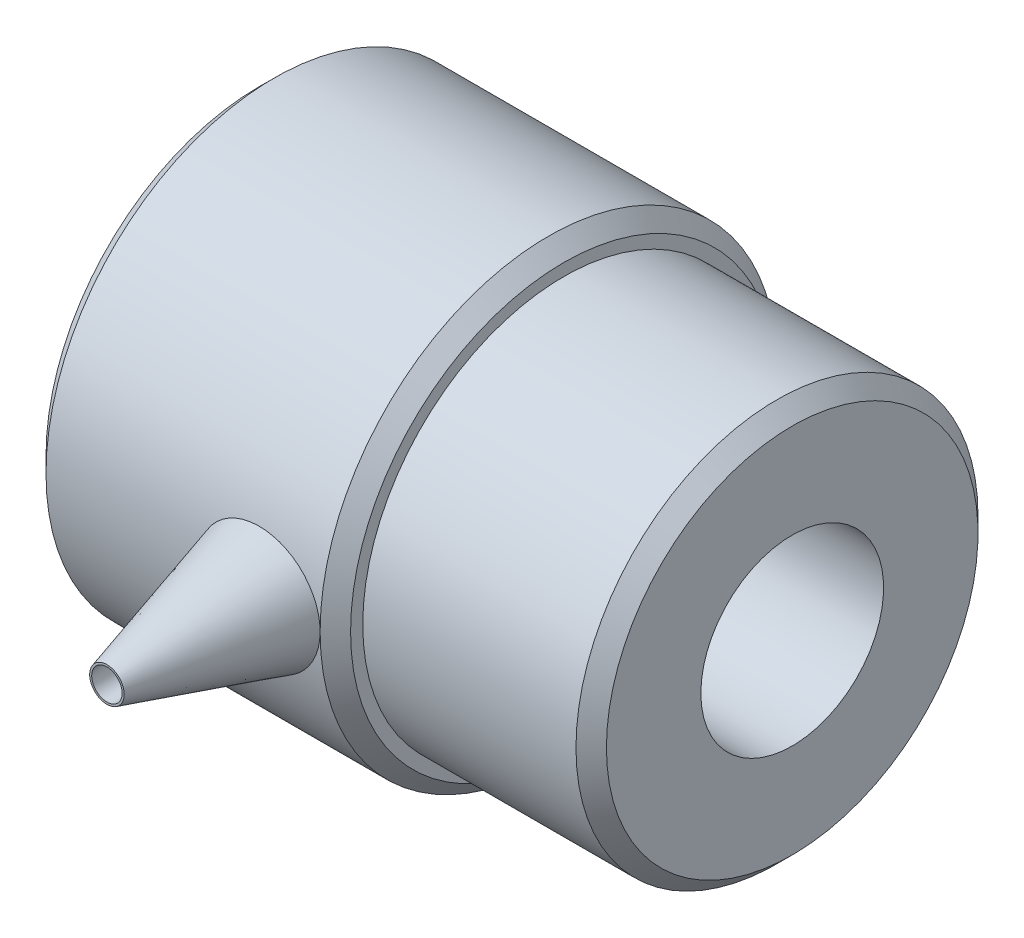
ISO-10303-21;
HEADER;
FILE_DESCRIPTION(('STEP AP214'),'2;1');
FILE_NAME('part.step','',(''),(''),'','','');
FILE_SCHEMA(('AUTOMOTIVE_DESIGN { 1 0 10303 214 1 1 1 1 }'));
ENDSEC;
DATA;
#1=APPLICATION_CONTEXT('core data for automotive mechanical design processes');
#2=APPLICATION_PROTOCOL_DEFINITION('international standard','automotive_design',2000,#1);
#3=PRODUCT_CONTEXT('',#1,'mechanical');
#4=PRODUCT('Part','Part','',(#3));
#5=PRODUCT_RELATED_PRODUCT_CATEGORY('part','',(#4));
#6=PRODUCT_DEFINITION_FORMATION('','',#4);
#7=PRODUCT_DEFINITION_CONTEXT('part definition',#1,'design');
#8=PRODUCT_DEFINITION('design','',#6,#7);
#9=PRODUCT_DEFINITION_SHAPE('','',#8);
#10=(LENGTH_UNIT() NAMED_UNIT(*) SI_UNIT(.MILLI.,.METRE.));
#11=(NAMED_UNIT(*) PLANE_ANGLE_UNIT() SI_UNIT($,.RADIAN.));
#12=(NAMED_UNIT(*) SI_UNIT($,.STERADIAN.) SOLID_ANGLE_UNIT());
#13=UNCERTAINTY_MEASURE_WITH_UNIT(LENGTH_MEASURE(1.E-05),#10,'distance_accuracy_value','');
#14=(GEOMETRIC_REPRESENTATION_CONTEXT(3) GLOBAL_UNCERTAINTY_ASSIGNED_CONTEXT((#13)) GLOBAL_UNIT_ASSIGNED_CONTEXT((#10,
#11,#12)) REPRESENTATION_CONTEXT('',''));
#15=CARTESIAN_POINT('',(0.,0.,0.));
#16=DIRECTION('',(0.,0.,1.));
#17=DIRECTION('',(1.,0.,0.));
#18=AXIS2_PLACEMENT_3D('',#15,#16,#17);
#19=CARTESIAN_POINT('',(-20.,0.,25.));
#20=DIRECTION('',(0.,0.,1.));
#21=DIRECTION('',(1.,0.,0.));
#22=AXIS2_PLACEMENT_3D('',#19,#20,#21);
#23=PLANE('',#22);
#24=CARTESIAN_POINT('',(-20.,0.,25.));
#25=DIRECTION('',(0.,0.,1.));
#26=DIRECTION('',(1.,0.,0.));
#27=AXIS2_PLACEMENT_3D('',#24,#25,#26);
#28=CIRCLE('',#27,1.13254614241192);
#29=CARTESIAN_POINT('',(-18.8674538575881,0.,25.));
#30=VERTEX_POINT('',#29);
#31=EDGE_CURVE('E13',#30,#30,#28,.T.);
#32=ORIENTED_EDGE('',*,*,#31,.T.);
#33=EDGE_LOOP('',(#32));
#34=FACE_BOUND('',#33,.T.);
#35=CARTESIAN_POINT('',(-20.,0.,25.));
#36=DIRECTION('',(0.,0.,1.));
#37=DIRECTION('',(1.,0.,0.));
#38=AXIS2_PLACEMENT_3D('',#35,#36,#37);
#39=CIRCLE('',#38,1.);
#40=CARTESIAN_POINT('',(-19.,0.,25.));
#41=VERTEX_POINT('',#40);
#42=EDGE_CURVE('E65',#41,#41,#39,.F.);
#43=ORIENTED_EDGE('',*,*,#42,.T.);
#44=EDGE_LOOP('',(#43));
#45=FACE_BOUND('',#44,.T.);
#46=ADVANCED_FACE('F54',(#34,#45),#23,.T.);
#47=CARTESIAN_POINT('',(-20.,0.,15.));
#48=DIRECTION('',(0.,0.,1.));
#49=DIRECTION('',(1.,0.,0.));
#50=AXIS2_PLACEMENT_3D('',#47,#48,#49);
#51=PLANE('',#50);
#52=CARTESIAN_POINT('',(-20.,0.,15.));
#53=DIRECTION('',(0.,0.,1.));
#54=DIRECTION('',(1.,0.,0.));
#55=AXIS2_PLACEMENT_3D('',#52,#53,#54);
#56=CIRCLE('',#55,4.);
#57=CARTESIAN_POINT('',(-16.,0.,15.));
#58=VERTEX_POINT('',#57);
#59=EDGE_CURVE('E61',#58,#58,#56,.T.);
#60=ORIENTED_EDGE('',*,*,#59,.F.);
#61=EDGE_LOOP('',(#60));
#62=FACE_BOUND('',#61,.T.);
#63=CARTESIAN_POINT('',(-20.,0.,15.));
#64=DIRECTION('',(0.,0.,1.));
#65=DIRECTION('',(1.,0.,0.));
#66=AXIS2_PLACEMENT_3D('',#63,#64,#65);
#67=CIRCLE('',#66,1.);
#68=CARTESIAN_POINT('',(-19.,0.,15.));
#69=VERTEX_POINT('',#68);
#70=EDGE_CURVE('E69',#69,#69,#67,.T.);
#71=ORIENTED_EDGE('',*,*,#70,.T.);
#72=EDGE_LOOP('',(#71));
#73=FACE_BOUND('',#72,.T.);
#74=ADVANCED_FACE('F75',(#62,#73),#51,.F.);
#75=CARTESIAN_POINT('',(-20.,0.,15.));
#76=DIRECTION('',(0.,0.,-1.));
#77=DIRECTION('',(1.,0.,0.));
#78=AXIS2_PLACEMENT_3D('',#75,#76,#77);
#79=CONICAL_SURFACE('',#78,4.,0.279252680319093);
#80=CARTESIAN_POINT('',(-18.8674538575881,0.,25.));
#81=CARTESIAN_POINT('',(-18.8375845465715,0.,24.8958333333333));
#82=CARTESIAN_POINT('',(-18.807715235555,0.,24.7916666666667));
#83=CARTESIAN_POINT('',(-18.7479766135219,0.,24.5833333333333));
#84=CARTESIAN_POINT('',(-18.7181073025054,0.,24.4791666666667));
#85=CARTESIAN_POINT('',(-18.6583686804723,0.,24.2708333333333));
#86=CARTESIAN_POINT('',(-18.6284993694557,0.,24.1666666666667));
#87=CARTESIAN_POINT('',(-18.5687607474227,0.,23.9583333333333));
#88=CARTESIAN_POINT('',(-18.5388914364061,0.,23.8541666666667));
#89=CARTESIAN_POINT('',(-18.479152814373,0.,23.6458333333333));
#90=CARTESIAN_POINT('',(-18.4492835033565,0.,23.5416666666667));
#91=CARTESIAN_POINT('',(-18.3895448813234,0.,23.3333333333333));
#92=CARTESIAN_POINT('',(-18.3596755703069,0.,23.2291666666667));
#93=CARTESIAN_POINT('',(-18.2999369482738,0.,23.0208333333333));
#94=CARTESIAN_POINT('',(-18.2700676372572,0.,22.9166666666667));
#95=CARTESIAN_POINT('',(-18.2103290152242,0.,22.7083333333333));
#96=CARTESIAN_POINT('',(-18.1804597042076,0.,22.6041666666667));
#97=CARTESIAN_POINT('',(-18.1207210821745,0.,22.3958333333333));
#98=CARTESIAN_POINT('',(-18.090851771158,0.,22.2916666666667));
#99=CARTESIAN_POINT('',(-18.0311131491249,0.,22.0833333333333));
#100=CARTESIAN_POINT('',(-18.0012438381084,0.,21.9791666666667));
#101=CARTESIAN_POINT('',(-17.9415052160753,0.,21.7708333333333));
#102=CARTESIAN_POINT('',(-17.9116359050587,0.,21.6666666666667));
#103=CARTESIAN_POINT('',(-17.8518972830256,0.,21.4583333333333));
#104=CARTESIAN_POINT('',(-17.8220279720091,0.,21.3541666666667));
#105=CARTESIAN_POINT('',(-17.762289349976,0.,21.1458333333333));
#106=CARTESIAN_POINT('',(-17.7324200389595,0.,21.0416666666667));
#107=CARTESIAN_POINT('',(-17.6726814169264,0.,20.8333333333333));
#108=CARTESIAN_POINT('',(-17.6428121059098,0.,20.7291666666667));
#109=CARTESIAN_POINT('',(-17.5830734838768,0.,20.5208333333333));
#110=CARTESIAN_POINT('',(-17.5532041728602,0.,20.4166666666667));
#111=CARTESIAN_POINT('',(-17.4934655508271,0.,20.2083333333333));
#112=CARTESIAN_POINT('',(-17.4635962398106,0.,20.1041666666667));
#113=CARTESIAN_POINT('',(-17.4038576177775,0.,19.8958333333333));
#114=CARTESIAN_POINT('',(-17.373988306761,0.,19.7916666666667));
#115=CARTESIAN_POINT('',(-17.3142496847279,0.,19.5833333333333));
#116=CARTESIAN_POINT('',(-17.2843803737113,0.,19.4791666666667));
#117=CARTESIAN_POINT('',(-17.2246417516782,0.,19.2708333333333));
#118=CARTESIAN_POINT('',(-17.1947724406617,0.,19.1666666666667));
#119=CARTESIAN_POINT('',(-17.1350338186286,0.,18.9583333333333));
#120=CARTESIAN_POINT('',(-17.1051645076121,0.,18.8541666666667));
#121=CARTESIAN_POINT('',(-17.045425885579,0.,18.6458333333333));
#122=CARTESIAN_POINT('',(-17.0155565745624,0.,18.5416666666667));
#123=CARTESIAN_POINT('',(-16.9558179525294,0.,18.3333333333333));
#124=CARTESIAN_POINT('',(-16.9259486415128,0.,18.2291666666667));
#125=CARTESIAN_POINT('',(-16.8662100194797,0.,18.0208333333333));
#126=CARTESIAN_POINT('',(-16.8363407084632,0.,17.9166666666667));
#127=CARTESIAN_POINT('',(-16.7766020864301,0.,17.7083333333333));
#128=CARTESIAN_POINT('',(-16.7467327754136,0.,17.6041666666667));
#129=CARTESIAN_POINT('',(-16.6869941533805,0.,17.3958333333333));
#130=CARTESIAN_POINT('',(-16.6571248423639,0.,17.2916666666667));
#131=CARTESIAN_POINT('',(-16.5973862203309,0.,17.0833333333333));
#132=CARTESIAN_POINT('',(-16.5675169093143,0.,16.9791666666667));
#133=CARTESIAN_POINT('',(-16.5077782872812,0.,16.7708333333333));
#134=CARTESIAN_POINT('',(-16.4779089762647,0.,16.6666666666667));
#135=CARTESIAN_POINT('',(-16.4181703542316,0.,16.4583333333333));
#136=CARTESIAN_POINT('',(-16.3883010432151,0.,16.3541666666667));
#137=CARTESIAN_POINT('',(-16.328562421182,0.,16.1458333333333));
#138=CARTESIAN_POINT('',(-16.2986931101654,0.,16.0416666666667));
#139=CARTESIAN_POINT('',(-16.2389544881323,0.,15.8333333333333));
#140=CARTESIAN_POINT('',(-16.2090851771158,0.,15.7291666666667));
#141=CARTESIAN_POINT('',(-16.1493465550827,0.,15.5208333333333));
#142=CARTESIAN_POINT('',(-16.1194772440662,0.,15.4166666666667));
#143=CARTESIAN_POINT('',(-16.0597386220331,0.,15.2083333333333));
#144=CARTESIAN_POINT('',(-16.0298693110165,0.,15.1041666666667));
#145=CARTESIAN_POINT('',(-16.,0.,15.));
#146=B_SPLINE_CURVE_WITH_KNOTS('',3,(#80,#81,#82,#83,#84,#85,#86,#87,#88,#89,#90,#91,#92,#93,
#94,#95,#96,#97,#98,#99,#100,#101,#102,#103,#104,#105,#106,#107,#108,#109,#110,#111,#112,#113,
#114,#115,#116,#117,#118,#119,#120,#121,#122,#123,#124,#125,#126,#127,#128,#129,#130,#131,#132,
#133,#134,#135,#136,#137,#138,#139,#140,#141,#142,#143,#144,#145),.UNSPECIFIED.,.F.,.F.,(4,2,2,
2,2,2,2,2,2,2,2,2,2,2,2,2,2,2,2,2,2,2,2,2,2,2,2,2,2,2,2,2,4),(0.,0.32509357370675,
0.650187147413502,0.975280721120249,1.300374294827,1.62546786853375,1.9505614422405,
2.27565501594725,2.600748589654,2.92584216336075,3.2509357370675,3.57602931077426,
3.90112288448101,4.22621645818776,4.55131003189451,4.87640360560126,5.20149717930801,
5.52659075301476,5.85168432672151,6.17677790042826,6.50187147413501,6.82696504784176,
7.15205862154852,7.47715219525527,7.80224576896202,8.12733934266877,8.45243291637552,
8.77752649008227,9.10262006378902,9.42771363749577,9.75280721120252,10.0779007849093,
10.402994358616),.UNSPECIFIED.);
#147=EDGE_CURVE('BSEAM56',#30,#58,#146,.T.);
#148=ORIENTED_EDGE('',*,*,#31,.F.);
#149=ORIENTED_EDGE('',*,*,#59,.T.);
#150=ORIENTED_EDGE('',*,*,#147,.T.);
#151=ORIENTED_EDGE('',*,*,#147,.F.);
#152=EDGE_LOOP('',(#148,#150,#149,#151));
#153=FACE_BOUND('',#152,.T.);
#154=ADVANCED_FACE('F56',(#153),#79,.T.);
#155=CARTESIAN_POINT('',(-20.,0.,35.));
#156=DIRECTION('',(0.,0.,-1.));
#157=DIRECTION('',(-1.,0.,0.));
#158=AXIS2_PLACEMENT_3D('',#155,#156,#157);
#159=CYLINDRICAL_SURFACE('',#158,1.);
#160=ORIENTED_EDGE('',*,*,#42,.F.);
#161=EDGE_LOOP('',(#160));
#162=FACE_BOUND('',#161,.T.);
#163=ORIENTED_EDGE('',*,*,#70,.F.);
#164=EDGE_LOOP('',(#163));
#165=FACE_BOUND('',#164,.T.);
#166=ADVANCED_FACE('F77',(#162,#165),#159,.F.);
#167=CLOSED_SHELL('',(#46,#74,#154,#166));
#168=MANIFOLD_SOLID_BREP('B2',#167);
#169=CARTESIAN_POINT('',(-35.,0.,0.));
#170=DIRECTION('',(-1.,0.,0.));
#171=DIRECTION('',(0.,0.,1.));
#172=AXIS2_PLACEMENT_3D('',#169,#170,#171);
#173=CYLINDRICAL_SURFACE('',#172,13.2);
#174=CARTESIAN_POINT('',(-1.,0.,0.));
#175=DIRECTION('',(-1.,0.,0.));
#176=DIRECTION('',(0.,0.,1.));
#177=AXIS2_PLACEMENT_3D('',#174,#175,#176);
#178=CIRCLE('',#177,13.2);
#179=CARTESIAN_POINT('',(-1.,0.,13.2));
#180=VERTEX_POINT('',#179);
#181=EDGE_CURVE('E136',#180,#180,#178,.T.);
#182=ORIENTED_EDGE('',*,*,#181,.T.);
#183=EDGE_LOOP('',(#182));
#184=FACE_BOUND('',#183,.T.);
#185=CARTESIAN_POINT('',(-15.,0.,0.));
#186=DIRECTION('',(-1.,0.,0.));
#187=DIRECTION('',(0.,0.,1.));
#188=AXIS2_PLACEMENT_3D('',#185,#186,#187);
#189=CIRCLE('',#188,13.2);
#190=CARTESIAN_POINT('',(-15.,0.,13.2));
#191=VERTEX_POINT('',#190);
#192=EDGE_CURVE('E184',#191,#191,#189,.T.);
#193=ORIENTED_EDGE('',*,*,#192,.F.);
#194=EDGE_LOOP('',(#193));
#195=FACE_BOUND('',#194,.T.);
#196=ADVANCED_FACE('F121',(#184,#195),#173,.T.);
#197=CARTESIAN_POINT('',(0.,6.,0.));
#198=DIRECTION('',(-1.,0.,0.));
#199=DIRECTION('',(0.,0.,1.));
#200=AXIS2_PLACEMENT_3D('',#197,#198,#199);
#201=PLANE('',#200);
#202=CARTESIAN_POINT('',(0.,0.,0.));
#203=DIRECTION('',(-1.,0.,0.));
#204=DIRECTION('',(0.,0.,1.));
#205=AXIS2_PLACEMENT_3D('',#202,#203,#204);
#206=CIRCLE('',#205,12.2);
#207=CARTESIAN_POINT('',(0.,0.,12.2));
#208=VERTEX_POINT('',#207);
#209=EDGE_CURVE('E132',#208,#208,#206,.F.);
#210=ORIENTED_EDGE('',*,*,#209,.T.);
#211=EDGE_LOOP('',(#210));
#212=FACE_BOUND('',#211,.T.);
#213=CARTESIAN_POINT('',(0.,0.,0.));
#214=DIRECTION('',(-1.,0.,0.));
#215=DIRECTION('',(0.,0.,1.));
#216=AXIS2_PLACEMENT_3D('',#213,#214,#215);
#217=CIRCLE('',#216,6.);
#218=CARTESIAN_POINT('',(0.,0.,6.));
#219=VERTEX_POINT('',#218);
#220=EDGE_CURVE('E166',#219,#219,#217,.T.);
#221=ORIENTED_EDGE('',*,*,#220,.T.);
#222=EDGE_LOOP('',(#221));
#223=FACE_BOUND('',#222,.T.);
#224=ADVANCED_FACE('F227',(#212,#223),#201,.F.);
#225=CARTESIAN_POINT('',(-35.,0.,0.));
#226=DIRECTION('',(-1.,0.,0.));
#227=DIRECTION('',(0.,0.,1.));
#228=AXIS2_PLACEMENT_3D('',#225,#226,#227);
#229=CYLINDRICAL_SURFACE('',#228,6.);
#230=CARTESIAN_POINT('',(-14.6196755796559,0.,0.));
#231=DIRECTION('',(1.,0.,0.));
#232=DIRECTION('',(0.,0.,-1.));
#233=AXIS2_PLACEMENT_3D('',#230,#231,#232);
#234=CIRCLE('',#233,6.);
#235=CARTESIAN_POINT('',(-14.6196755796559,0.,-6.));
#236=VERTEX_POINT('',#235);
#237=EDGE_CURVE('E157',#236,#236,#234,.F.);
#238=ORIENTED_EDGE('',*,*,#237,.T.);
#239=EDGE_LOOP('',(#238));
#240=FACE_BOUND('',#239,.T.);
#241=ORIENTED_EDGE('',*,*,#220,.F.);
#242=EDGE_LOOP('',(#241));
#243=FACE_BOUND('',#242,.T.);
#244=ADVANCED_FACE('F233',(#240,#243),#229,.F.);
#245=CARTESIAN_POINT('',(-15.1196755796559,11.,0.));
#246=DIRECTION('',(1.,0.,0.));
#247=DIRECTION('',(0.,0.,-1.));
#248=AXIS2_PLACEMENT_3D('',#245,#246,#247);
#249=PLANE('',#248);
#250=CARTESIAN_POINT('',(-15.1196755796559,0.,0.));
#251=DIRECTION('',(1.,0.,0.));
#252=DIRECTION('',(0.,0.,-1.));
#253=AXIS2_PLACEMENT_3D('',#250,#251,#252);
#254=CIRCLE('',#253,6.50000000000001);
#255=CARTESIAN_POINT('',(-15.1196755796559,0.,-6.50000000000001));
#256=VERTEX_POINT('',#255);
#257=EDGE_CURVE('E154',#256,#256,#254,.T.);
#258=ORIENTED_EDGE('',*,*,#257,.T.);
#259=EDGE_LOOP('',(#258));
#260=FACE_BOUND('',#259,.T.);
#261=CARTESIAN_POINT('',(-15.1196755796559,0.,0.));
#262=DIRECTION('',(-1.,0.,0.));
#263=DIRECTION('',(0.,0.,1.));
#264=AXIS2_PLACEMENT_3D('',#261,#262,#263);
#265=CIRCLE('',#264,11.);
#266=CARTESIAN_POINT('',(-15.1196755796559,0.,11.));
#267=VERTEX_POINT('',#266);
#268=EDGE_CURVE('E169',#267,#267,#265,.T.);
#269=ORIENTED_EDGE('',*,*,#268,.T.);
#270=EDGE_LOOP('',(#269));
#271=FACE_BOUND('',#270,.T.);
#272=ADVANCED_FACE('F335',(#260,#271),#249,.F.);
#273=CARTESIAN_POINT('',(-35.,0.,0.));
#274=DIRECTION('',(-1.,0.,0.));
#275=DIRECTION('',(0.,0.,1.));
#276=AXIS2_PLACEMENT_3D('',#273,#274,#275);
#277=CYLINDRICAL_SURFACE('',#276,11.);
#278=ORIENTED_EDGE('',*,*,#268,.F.);
#279=EDGE_LOOP('',(#278));
#280=FACE_BOUND('',#279,.T.);
#281=CARTESIAN_POINT('',(-17.1196755796559,0.,0.));
#282=DIRECTION('',(-1.,0.,0.));
#283=DIRECTION('',(0.,0.,1.));
#284=AXIS2_PLACEMENT_3D('',#281,#282,#283);
#285=CIRCLE('',#284,11.);
#286=CARTESIAN_POINT('',(-17.1196755796559,0.,11.));
#287=VERTEX_POINT('',#286);
#288=EDGE_CURVE('E172',#287,#287,#285,.T.);
#289=ORIENTED_EDGE('',*,*,#288,.T.);
#290=EDGE_LOOP('',(#289));
#291=FACE_BOUND('',#290,.T.);
#292=ADVANCED_FACE('F327',(#280,#291),#277,.F.);
#293=CARTESIAN_POINT('',(-17.1196755796559,10.,0.));
#294=DIRECTION('',(-1.,0.,0.));
#295=DIRECTION('',(0.,0.,1.));
#296=AXIS2_PLACEMENT_3D('',#293,#294,#295);
#297=PLANE('',#296);
#298=ORIENTED_EDGE('',*,*,#288,.F.);
#299=EDGE_LOOP('',(#298));
#300=FACE_BOUND('',#299,.T.);
#301=CARTESIAN_POINT('',(-17.1196755796559,0.,0.));
#302=DIRECTION('',(-1.,0.,0.));
#303=DIRECTION('',(0.,0.,1.));
#304=AXIS2_PLACEMENT_3D('',#301,#302,#303);
#305=CIRCLE('',#304,10.);
#306=CARTESIAN_POINT('',(-17.1196755796559,0.,10.));
#307=VERTEX_POINT('',#306);
#308=EDGE_CURVE('E175',#307,#307,#305,.T.);
#309=ORIENTED_EDGE('',*,*,#308,.T.);
#310=EDGE_LOOP('',(#309));
#311=FACE_BOUND('',#310,.T.);
#312=ADVANCED_FACE('F223',(#300,#311),#297,.F.);
#313=CARTESIAN_POINT('',(-35.,0.,0.));
#314=DIRECTION('',(-1.,0.,0.));
#315=DIRECTION('',(0.,0.,1.));
#316=AXIS2_PLACEMENT_3D('',#313,#314,#315);
#317=CYLINDRICAL_SURFACE('',#316,10.);
#318=CARTESIAN_POINT('',(-17.5,0.,10.));
#319=CARTESIAN_POINT('',(-17.5000038762303,0.138126814449552,9.99999766446687));
#320=CARTESIAN_POINT('',(-17.5114859179563,0.276296929717938,9.99710963553044));
#321=CARTESIAN_POINT('',(-17.557041918845,0.548677206284221,9.98586856383157));
#322=CARTESIAN_POINT('',(-17.5911286825631,0.682885078117899,9.97751242366627));
#323=CARTESIAN_POINT('',(-17.6807320891035,0.943368120304295,9.9562604388672));
#324=CARTESIAN_POINT('',(-17.7362229978588,1.06965260571667,9.94337004736764));
#325=CARTESIAN_POINT('',(-17.8669689834081,1.31112021984071,9.91442239679369));
#326=CARTESIAN_POINT('',(-17.942224726865,1.4263029739146,9.89836503090261));
#327=CARTESIAN_POINT('',(-18.1120013160903,1.64466987883486,9.86445689319489));
#328=CARTESIAN_POINT('',(-18.2068526249318,1.74759281676843,9.84657845246877));
#329=CARTESIAN_POINT('',(-18.4124203415151,1.93624821200553,9.8112270019656));
#330=CARTESIAN_POINT('',(-18.5231385382449,2.02197872824865,9.79375403816446));
#331=CARTESIAN_POINT('',(-18.759325377895,2.17504423799829,9.76091292830281));
#332=CARTESIAN_POINT('',(-18.8849887180146,2.2420870265419,9.74557990774685));
#333=CARTESIAN_POINT('',(-19.1462473527667,2.35399484758457,9.71915824696694));
#334=CARTESIAN_POINT('',(-19.2818410555534,2.39886342573357,9.70806892824031));
#335=CARTESIAN_POINT('',(-19.5562391636694,2.46425806134127,9.69167461160538));
#336=CARTESIAN_POINT('',(-19.69492482673,2.48525378055342,9.68625818328352));
#337=CARTESIAN_POINT('',(-19.9739476149989,2.50376962511068,9.68148937432652));
#338=CARTESIAN_POINT('',(-20.1142844678202,2.50129356969685,9.68213600713215));
#339=CARTESIAN_POINT('',(-20.3890263462423,2.47331087439951,9.68932009194695));
#340=CARTESIAN_POINT('',(-20.5234927024422,2.44836390031772,9.69571438345489));
#341=CARTESIAN_POINT('',(-20.7862684181851,2.37704031150499,9.71344516118448));
#342=CARTESIAN_POINT('',(-20.9145773383815,2.33066217011565,9.72478199948731));
#343=CARTESIAN_POINT('',(-21.1628966937536,2.21731579656197,9.75125189842765));
#344=CARTESIAN_POINT('',(-21.282810286316,2.1501444453882,9.76642212449693));
#345=CARTESIAN_POINT('',(-21.5098645162614,1.99726046002491,9.79882851409985));
#346=CARTESIAN_POINT('',(-21.6170029134454,1.91154458134806,9.81606503891047));
#347=CARTESIAN_POINT('',(-21.818672692824,1.72110570780203,9.85126467566486));
#348=CARTESIAN_POINT('',(-21.9127574834356,1.61591043027643,9.86923449130002));
#349=CARTESIAN_POINT('',(-22.0820354041065,1.39101986250616,9.90343275964594));
#350=CARTESIAN_POINT('',(-22.1572279571059,1.27132412951324,9.91966115915679));
#351=CARTESIAN_POINT('',(-22.2867509770406,1.02019314780232,9.9486288682365));
#352=CARTESIAN_POINT('',(-22.3410089004241,0.888718988681039,9.96135600212878));
#353=CARTESIAN_POINT('',(-22.4265288428493,0.618126680238138,9.98179861652361));
#354=CARTESIAN_POINT('',(-22.4577952606969,0.479009998584141,9.98951505565468));
#355=CARTESIAN_POINT('',(-22.4957626092647,0.200899950650044,9.99892498785624));
#356=CARTESIAN_POINT('',(-22.5030717101255,0.0619945333136831,10.0007675584713));
#357=CARTESIAN_POINT('',(-22.4945849965742,-0.215054791335847,9.99864674690754));
#358=CARTESIAN_POINT('',(-22.4787912620014,-0.353198766074327,9.99468388736421));
#359=CARTESIAN_POINT('',(-22.4250484860144,-0.622690447960817,9.98149301878918));
#360=CARTESIAN_POINT('',(-22.3874312275384,-0.754108531614583,9.97234390309647));
#361=CARTESIAN_POINT('',(-22.2914881932859,-1.00876215408753,9.94981177723595));
#362=CARTESIAN_POINT('',(-22.2331603261446,-1.13199686505442,9.93642833949965));
#363=CARTESIAN_POINT('',(-22.0962731185422,-1.36920522404972,9.9065551321037));
#364=CARTESIAN_POINT('',(-22.0173731460057,-1.48297573639294,9.89001445610999));
#365=CARTESIAN_POINT('',(-21.8420168186714,-1.69587768940552,9.85574181979586));
#366=CARTESIAN_POINT('',(-21.7455574339706,-1.79500659828875,9.83800965421578));
#367=CARTESIAN_POINT('',(-21.5349967319272,-1.97831761345414,9.80281594932498));
#368=CARTESIAN_POINT('',(-21.4205204950007,-2.06207311270184,9.78537173637463));
#369=CARTESIAN_POINT('',(-21.1787789425524,-2.20918459835604,9.75321463970069));
#370=CARTESIAN_POINT('',(-21.0515141950493,-2.27254149026901,9.73850163474941));
#371=CARTESIAN_POINT('',(-20.7884904626563,-2.37658570101223,9.71363491194665));
#372=CARTESIAN_POINT('',(-20.6527872861462,-2.41740732773931,9.70345425375809));
#373=CARTESIAN_POINT('',(-20.3761506035745,-2.47557609990489,9.68877906706586));
#374=CARTESIAN_POINT('',(-20.2352182482976,-2.49292837912652,9.68428329504044));
#375=CARTESIAN_POINT('',(-19.9564649602307,-2.50339765056083,9.68158168701612));
#376=CARTESIAN_POINT('',(-19.8186709414559,-2.49719649630131,9.68319887888034));
#377=CARTESIAN_POINT('',(-19.5461601855562,-2.46229546385366,9.69213181672143));
#378=CARTESIAN_POINT('',(-19.4114433866447,-2.43359603781098,9.69944744817731));
#379=CARTESIAN_POINT('',(-19.1496525682236,-2.35488553240495,9.71885434473222));
#380=CARTESIAN_POINT('',(-19.0225378245995,-2.30500234113404,9.73091692061057));
#381=CARTESIAN_POINT('',(-18.7783910288107,-2.18544152267504,9.7584625954084));
#382=CARTESIAN_POINT('',(-18.6613603780219,-2.11576115005696,9.77394616867808));
#383=CARTESIAN_POINT('',(-18.4374089516633,-1.95644624772858,9.80709390439337));
#384=CARTESIAN_POINT('',(-18.3308315442934,-1.86633860485376,9.82480441386302));
#385=CARTESIAN_POINT('',(-18.1340882586743,-1.66964895198288,9.86013378743769));
#386=CARTESIAN_POINT('',(-18.0439262831451,-1.56306303543524,9.87775262878422));
#387=CARTESIAN_POINT('',(-17.8809811523923,-1.33411264450432,9.9112942607945));
#388=CARTESIAN_POINT('',(-17.8085423105474,-1.21149737052731,9.92718055609783));
#389=CARTESIAN_POINT('',(-17.6854208950991,-0.955443432517458,9.95508208291861));
#390=CARTESIAN_POINT('',(-17.6347227322524,-0.822012605727898,9.96710008666301));
#391=CARTESIAN_POINT('',(-17.5640469494506,-0.574017088739119,9.98413432609236));
#392=CARTESIAN_POINT('',(-17.5400812615776,-0.460633618180114,9.99004308421151));
#393=CARTESIAN_POINT('',(-17.5080567606301,-0.231510119227139,9.9979767538658));
#394=CARTESIAN_POINT('',(-17.4999967511578,-0.115770268737694,10.0000019575149));
#395=CARTESIAN_POINT('',(-17.5,0.,10.));
#396=B_SPLINE_CURVE_WITH_KNOTS('',3,(#318,#319,#320,#321,#322,#323,#324,#325,#326,#327,#328,
#329,#330,#331,#332,#333,#334,#335,#336,#337,#338,#339,#340,#341,#342,#343,#344,#345,#346,#347,
#348,#349,#350,#351,#352,#353,#354,#355,#356,#357,#358,#359,#360,#361,#362,#363,#364,#365,#366,
#367,#368,#369,#370,#371,#372,#373,#374,#375,#376,#377,#378,#379,#380,#381,#382,#383,#384,#385,
#386,#387,#388,#389,#390,#391,#392,#393,#394,#395),.UNSPECIFIED.,.T.,.F.,(4,2,2,2,2,2,2,2,2,2,2,
2,2,2,2,2,2,2,2,2,2,2,2,2,2,2,2,2,2,2,2,2,2,2,2,2,2,2,4),(0.,0.413956187453149,
0.828147062939832,1.24184150381018,1.65554990028221,2.07690725728565,2.4983121596677,
2.92597745909678,3.35357435282281,3.77260491835117,4.19156730193363,4.60037495017231,
5.00921172448931,5.42217546462,5.83521151399139,6.26002501620566,6.68485149269279,
7.11113715020724,7.53734122819939,7.95263848254328,8.36789835193438,8.77700457528929,
9.18615212209351,9.6025597928112,10.0190393835223,10.4457418201299,10.8724253125471,
11.2965375769764,11.7205570543048,12.1323963400748,12.5442273493652,12.9536066760887,
13.3630428023796,13.7831596069298,14.2033761629383,14.6312030917578,15.0587227304538,
15.4057040491338,15.7526592674819),.UNSPECIFIED.);
#397=CARTESIAN_POINT('',(-17.5,0.,10.));
#398=VERTEX_POINT('',#397);
#399=EDGE_CURVE('E187',#398,#398,#396,.T.);
#400=ORIENTED_EDGE('',*,*,#399,.T.);
#401=EDGE_LOOP('',(#400));
#402=FACE_BOUND('',#401,.T.);
#403=CARTESIAN_POINT('',(-32.5,0.,0.));
#404=DIRECTION('',(1.,0.,0.));
#405=DIRECTION('',(0.,0.,-1.));
#406=AXIS2_PLACEMENT_3D('',#403,#404,#405);
#407=CIRCLE('',#406,10.);
#408=CARTESIAN_POINT('',(-32.5,0.,-10.));
#409=VERTEX_POINT('',#408);
#410=EDGE_CURVE('E163',#409,#409,#407,.F.);
#411=ORIENTED_EDGE('',*,*,#410,.T.);
#412=EDGE_LOOP('',(#411));
#413=FACE_BOUND('',#412,.T.);
#414=ORIENTED_EDGE('',*,*,#308,.F.);
#415=EDGE_LOOP('',(#414));
#416=FACE_BOUND('',#415,.T.);
#417=ADVANCED_FACE('F192',(#402,#413,#416),#317,.F.);
#418=CARTESIAN_POINT('',(-33.,11.,0.));
#419=DIRECTION('',(1.,0.,0.));
#420=DIRECTION('',(0.,0.,-1.));
#421=AXIS2_PLACEMENT_3D('',#418,#419,#420);
#422=PLANE('',#421);
#423=CARTESIAN_POINT('',(-33.,0.,0.));
#424=DIRECTION('',(1.,0.,0.));
#425=DIRECTION('',(0.,0.,-1.));
#426=AXIS2_PLACEMENT_3D('',#423,#424,#425);
#427=CIRCLE('',#426,10.5);
#428=CARTESIAN_POINT('',(-33.,0.,-10.5));
#429=VERTEX_POINT('',#428);
#430=EDGE_CURVE('E160',#429,#429,#427,.T.);
#431=ORIENTED_EDGE('',*,*,#430,.T.);
#432=EDGE_LOOP('',(#431));
#433=FACE_BOUND('',#432,.T.);
#434=CARTESIAN_POINT('',(-33.,0.,0.));
#435=DIRECTION('',(-1.,0.,0.));
#436=DIRECTION('',(0.,0.,1.));
#437=AXIS2_PLACEMENT_3D('',#434,#435,#436);
#438=CIRCLE('',#437,11.);
#439=CARTESIAN_POINT('',(-33.,0.,11.));
#440=VERTEX_POINT('',#439);
#441=EDGE_CURVE('E178',#440,#440,#438,.T.);
#442=ORIENTED_EDGE('',*,*,#441,.T.);
#443=EDGE_LOOP('',(#442));
#444=FACE_BOUND('',#443,.T.);
#445=ADVANCED_FACE('F216',(#433,#444),#422,.F.);
#446=CARTESIAN_POINT('',(-35.,0.,0.));
#447=DIRECTION('',(-1.,0.,0.));
#448=DIRECTION('',(0.,0.,1.));
#449=AXIS2_PLACEMENT_3D('',#446,#447,#448);
#450=CYLINDRICAL_SURFACE('',#449,11.);
#451=ORIENTED_EDGE('',*,*,#441,.F.);
#452=EDGE_LOOP('',(#451));
#453=FACE_BOUND('',#452,.T.);
#454=CARTESIAN_POINT('',(-35.,0.,0.));
#455=DIRECTION('',(-1.,0.,0.));
#456=DIRECTION('',(0.,0.,1.));
#457=AXIS2_PLACEMENT_3D('',#454,#455,#456);
#458=CIRCLE('',#457,11.);
#459=CARTESIAN_POINT('',(-35.,0.,11.));
#460=VERTEX_POINT('',#459);
#461=EDGE_CURVE('E181',#460,#460,#458,.T.);
#462=ORIENTED_EDGE('',*,*,#461,.T.);
#463=EDGE_LOOP('',(#462));
#464=FACE_BOUND('',#463,.T.);
#465=ADVANCED_FACE('F213',(#453,#464),#450,.F.);
#466=CARTESIAN_POINT('',(-35.,15.,0.));
#467=DIRECTION('',(1.,0.,0.));
#468=DIRECTION('',(0.,0.,-1.));
#469=AXIS2_PLACEMENT_3D('',#466,#467,#468);
#470=PLANE('',#469);
#471=CARTESIAN_POINT('',(-35.,0.,0.));
#472=DIRECTION('',(1.,0.,0.));
#473=DIRECTION('',(0.,0.,-1.));
#474=AXIS2_PLACEMENT_3D('',#471,#472,#473);
#475=CIRCLE('',#474,14.);
#476=CARTESIAN_POINT('',(-35.,0.,-14.));
#477=VERTEX_POINT('',#476);
#478=EDGE_CURVE('E151',#477,#477,#475,.F.);
#479=ORIENTED_EDGE('',*,*,#478,.T.);
#480=EDGE_LOOP('',(#479));
#481=FACE_BOUND('',#480,.T.);
#482=ORIENTED_EDGE('',*,*,#461,.F.);
#483=EDGE_LOOP('',(#482));
#484=FACE_BOUND('',#483,.T.);
#485=ADVANCED_FACE('F210',(#481,#484),#470,.F.);
#486=CARTESIAN_POINT('',(-35.,0.,0.));
#487=DIRECTION('',(-1.,0.,0.));
#488=DIRECTION('',(0.,0.,1.));
#489=AXIS2_PLACEMENT_3D('',#486,#487,#488);
#490=CYLINDRICAL_SURFACE('',#489,15.);
#491=CARTESIAN_POINT('',(-17.5,0.,15.));
#492=CARTESIAN_POINT('',(-17.5000055889478,-0.139390904958215,14.9999976116882));
#493=CARTESIAN_POINT('',(-17.5116972749689,-0.278857881838821,14.9980367791303));
#494=CARTESIAN_POINT('',(-17.5581356587653,-0.553880221673042,14.9904034494139));
#495=CARTESIAN_POINT('',(-17.5929035569116,-0.689431867959247,14.9847275392389));
#496=CARTESIAN_POINT('',(-17.6844154485928,-0.952604747212642,14.9703006823645));
#497=CARTESIAN_POINT('',(-17.7411414656406,-1.0802323684319,14.9615522515919));
#498=CARTESIAN_POINT('',(-17.8749122920524,-1.32414184197794,14.9419422708207));
#499=CARTESIAN_POINT('',(-17.951954777483,-1.44042498987859,14.9310809625443));
#500=CARTESIAN_POINT('',(-18.1249550838205,-1.65947261429168,14.9083331745831));
#501=CARTESIAN_POINT('',(-18.2210691146361,-1.76211290353497,14.8964387181486));
#502=CARTESIAN_POINT('',(-18.4291479684728,-1.94988849865993,14.8730262687673));
#503=CARTESIAN_POINT('',(-18.5411137914566,-2.03502269939097,14.8615082996267));
#504=CARTESIAN_POINT('',(-18.7785709661971,-2.18586712560513,14.8400756575978));
#505=CARTESIAN_POINT('',(-18.9041413368048,-2.251454552861,14.8301712909164));
#506=CARTESIAN_POINT('',(-19.1647095643006,-2.36055836541122,14.8131978979467));
#507=CARTESIAN_POINT('',(-19.2997067836776,-2.40407624156561,14.8061286801431));
#508=CARTESIAN_POINT('',(-19.5739802748565,-2.46741437778481,14.7957053684275));
#509=CARTESIAN_POINT('',(-19.7132057365014,-2.4874490291354,14.792317684857));
#510=CARTESIAN_POINT('',(-19.9930802768835,-2.50391672528987,14.7895393893665));
#511=CARTESIAN_POINT('',(-20.1337292541673,-2.50035144038899,14.7901484945721));
#512=CARTESIAN_POINT('',(-20.4109278612755,-2.46989509839615,14.7952642886355));
#513=CARTESIAN_POINT('',(-20.5475048035452,-2.44324488188977,14.7997307331892));
#514=CARTESIAN_POINT('',(-20.8142213178291,-2.36775314040344,14.8119949521101));
#515=CARTESIAN_POINT('',(-20.9443606688885,-2.31891085431974,14.8197928407327));
#516=CARTESIAN_POINT('',(-21.1952288234409,-2.20017724609391,14.837884793341));
#517=CARTESIAN_POINT('',(-21.3159094060812,-2.13018591387971,14.8481906710732));
#518=CARTESIAN_POINT('',(-21.5439044005384,-1.97121201755743,14.8701291841501));
#519=CARTESIAN_POINT('',(-21.6512177324549,-1.88222792065429,14.8817619265429));
#520=CARTESIAN_POINT('',(-21.8508260858073,-1.68648221215905,14.9052202787978));
#521=CARTESIAN_POINT('',(-21.9429185185401,-1.57951396387313,14.9170464923165));
#522=CARTESIAN_POINT('',(-22.1078777626653,-1.35153524898165,14.9394260139672));
#523=CARTESIAN_POINT('',(-22.1807444501832,-1.23052469190642,14.9499793138974));
#524=CARTESIAN_POINT('',(-22.3052022271363,-0.977705916166711,14.9686389289291));
#525=CARTESIAN_POINT('',(-22.3567754193313,-0.845888725564661,14.9767431840745));
#526=CARTESIAN_POINT('',(-22.436994215246,-0.575298345602731,14.9895750301266));
#527=CARTESIAN_POINT('',(-22.4656417369737,-0.436525739179466,14.9943029035047));
#528=CARTESIAN_POINT('',(-22.4989213584611,-0.157709901301622,14.9998112984269));
#529=CARTESIAN_POINT('',(-22.5038315718056,-0.0177007371510095,15.0006375301278));
#530=CARTESIAN_POINT('',(-22.4902386555719,0.261139772889889,14.9983747442117));
#531=CARTESIAN_POINT('',(-22.4717364268663,0.39997116389204,14.9952858772412));
#532=CARTESIAN_POINT('',(-22.4120751506645,0.671656175546764,14.985568269382));
#533=CARTESIAN_POINT('',(-22.3710537916099,0.804540868385379,14.9789610480131));
#534=CARTESIAN_POINT('',(-22.2676654818005,1.06154688486044,14.9629446445536));
#535=CARTESIAN_POINT('',(-22.2052973323647,1.18566771590972,14.9535353051202));
#536=CARTESIAN_POINT('',(-22.0603488753032,1.42283068946896,14.9328451630241));
#537=CARTESIAN_POINT('',(-21.9775948438328,1.53576525093715,14.9215485588702));
#538=CARTESIAN_POINT('',(-21.7944626846149,1.74624358550269,14.898384673919));
#539=CARTESIAN_POINT('',(-21.6940832767233,1.84378623969658,14.8865173517155));
#540=CARTESIAN_POINT('',(-21.4773024519286,2.021742779658,14.8634017523584));
#541=CARTESIAN_POINT('',(-21.3607458344856,2.10196876111371,14.8521611613711));
#542=CARTESIAN_POINT('',(-21.1156470308615,2.24170231029498,14.8317152977788));
#543=CARTESIAN_POINT('',(-20.9871052247725,2.30121053476982,14.8225099606602));
#544=CARTESIAN_POINT('',(-20.7222102671879,2.39753833147315,14.807234536977));
#545=CARTESIAN_POINT('',(-20.5858919049695,2.43445143254794,14.8011515431106));
#546=CARTESIAN_POINT('',(-20.3088798707782,2.48483545377828,14.7927771683526));
#547=CARTESIAN_POINT('',(-20.1681865802679,2.49830841194617,14.7904854578272));
#548=CARTESIAN_POINT('',(-19.8882948340376,2.50137286604735,14.7899673308401));
#549=CARTESIAN_POINT('',(-19.7490996214247,2.49126013612519,14.7916905650565));
#550=CARTESIAN_POINT('',(-19.4744207519492,2.44807983895685,14.7988978145373));
#551=CARTESIAN_POINT('',(-19.3389370830581,2.41501234611248,14.8043818176121));
#552=CARTESIAN_POINT('',(-19.0756415627074,2.3269744895949,14.8184735628172));
#553=CARTESIAN_POINT('',(-18.947820989944,2.27202959060044,14.8270776721967));
#554=CARTESIAN_POINT('',(-18.7031643308052,2.14182700391591,14.8464436892221));
#555=CARTESIAN_POINT('',(-18.5863287896279,2.06656830874856,14.857205703884));
#556=CARTESIAN_POINT('',(-18.3654644168923,1.89681888437216,14.8798345404562));
#557=CARTESIAN_POINT('',(-18.2616039832997,1.80211056359365,14.891712955763));
#558=CARTESIAN_POINT('',(-18.0711483955251,1.59660903138023,14.9151437236084));
#559=CARTESIAN_POINT('',(-17.9845572313618,1.48581211291264,14.9266960002655));
#560=CARTESIAN_POINT('',(-17.8305517318001,1.25036916964028,14.9482652964222));
#561=CARTESIAN_POINT('',(-17.7632739606871,1.12563278753282,14.958271162531));
#562=CARTESIAN_POINT('',(-17.6507305153901,0.866513069378982,14.9755116760177));
#563=CARTESIAN_POINT('',(-17.6054429189203,0.732139494830011,14.9827490817748));
#564=CARTESIAN_POINT('',(-17.5479947258733,0.497703310045402,14.9920579083295));
#565=CARTESIAN_POINT('',(-17.530025530384,0.399058830298448,14.9950202727336));
#566=CARTESIAN_POINT('',(-17.5060262621552,0.200289310319809,14.9989921598612));
#567=CARTESIAN_POINT('',(-17.4999959838626,0.100164295608494,15.0000017162064));
#568=CARTESIAN_POINT('',(-17.5,0.,15.));
#569=B_SPLINE_CURVE_WITH_KNOTS('',3,(#491,#492,#493,#494,#495,#496,#497,#498,#499,#500,#501,
#502,#503,#504,#505,#506,#507,#508,#509,#510,#511,#512,#513,#514,#515,#516,#517,#518,#519,#520,
#521,#522,#523,#524,#525,#526,#527,#528,#529,#530,#531,#532,#533,#534,#535,#536,#537,#538,#539,
#540,#541,#542,#543,#544,#545,#546,#547,#548,#549,#550,#551,#552,#553,#554,#555,#556,#557,#558,
#559,#560,#561,#562,#563,#564,#565,#566,#567,#568),.UNSPECIFIED.,.T.,.F.,(4,2,2,2,2,2,2,2,2,2,2,
2,2,2,2,2,2,2,2,2,2,2,2,2,2,2,2,2,2,2,2,2,2,2,2,2,2,2,4),(0.,0.417806584938509,0.83599754569542,
1.25384686702527,1.67164841267479,2.09302491062332,2.51442800169857,2.93842520823839,
3.36239376876181,3.78246077103424,4.20249804320887,4.61820521760409,5.03392665025381,
5.45164556632557,5.86939820680573,6.29232769911326,6.71525991635847,7.13854688915903,
7.56179844521149,7.98007883491397,8.39834313035859,8.81407807006415,9.22983635826066,
9.64926825627023,10.0687306305428,10.4925382200762,10.9163323737594,11.3383602234177,
11.7603513778662,12.177079095227,12.5938054618813,13.0100481822622,13.4263115502933,
13.8475138419339,14.2688133387897,14.693022316072,15.1168075213007,15.4170424816402,
15.7172722727697),.UNSPECIFIED.);
#570=CARTESIAN_POINT('',(-17.5,0.,15.));
#571=VERTEX_POINT('',#570);
#572=EDGE_CURVE('E53',#571,#571,#569,.T.);
#573=ORIENTED_EDGE('',*,*,#572,.T.);
#574=EDGE_LOOP('',(#573));
#575=FACE_BOUND('',#574,.T.);
#576=CARTESIAN_POINT('',(-34.,0.,0.));
#577=DIRECTION('',(1.,0.,0.));
#578=DIRECTION('',(0.,0.,-1.));
#579=AXIS2_PLACEMENT_3D('',#576,#577,#578);
#580=CIRCLE('',#579,15.);
#581=CARTESIAN_POINT('',(-34.,0.,-15.));
#582=VERTEX_POINT('',#581);
#583=EDGE_CURVE('E145',#582,#582,#580,.T.);
#584=ORIENTED_EDGE('',*,*,#583,.T.);
#585=EDGE_LOOP('',(#584));
#586=FACE_BOUND('',#585,.T.);
#587=CARTESIAN_POINT('',(-16.,0.,0.));
#588=DIRECTION('',(-1.,0.,0.));
#589=DIRECTION('',(0.,0.,1.));
#590=AXIS2_PLACEMENT_3D('',#587,#588,#589);
#591=CIRCLE('',#590,15.);
#592=CARTESIAN_POINT('',(-16.,0.,15.));
#593=VERTEX_POINT('',#592);
#594=EDGE_CURVE('E148',#593,#593,#591,.T.);
#595=ORIENTED_EDGE('',*,*,#594,.T.);
#596=EDGE_LOOP('',(#595));
#597=FACE_BOUND('',#596,.T.);
#598=ADVANCED_FACE('F205',(#575,#586,#597),#490,.T.);
#599=CARTESIAN_POINT('',(-15.,13.2,0.));
#600=DIRECTION('',(-1.,0.,0.));
#601=DIRECTION('',(0.,0.,1.));
#602=AXIS2_PLACEMENT_3D('',#599,#600,#601);
#603=PLANE('',#602);
#604=CARTESIAN_POINT('',(-15.,0.,0.));
#605=DIRECTION('',(-1.,0.,0.));
#606=DIRECTION('',(0.,0.,1.));
#607=AXIS2_PLACEMENT_3D('',#604,#605,#606);
#608=CIRCLE('',#607,14.);
#609=CARTESIAN_POINT('',(-15.,0.,14.));
#610=VERTEX_POINT('',#609);
#611=EDGE_CURVE('E140',#610,#610,#608,.F.);
#612=ORIENTED_EDGE('',*,*,#611,.T.);
#613=EDGE_LOOP('',(#612));
#614=FACE_BOUND('',#613,.T.);
#615=ORIENTED_EDGE('',*,*,#192,.T.);
#616=EDGE_LOOP('',(#615));
#617=FACE_BOUND('',#616,.T.);
#618=ADVANCED_FACE('F201',(#614,#617),#603,.F.);
#619=CARTESIAN_POINT('',(-32.5,0.,0.));
#620=DIRECTION('',(-1.,0.,0.));
#621=DIRECTION('',(0.,0.,1.));
#622=AXIS2_PLACEMENT_3D('',#619,#620,#621);
#623=CONICAL_SURFACE('',#622,10.,0.78539816339745);
#624=ORIENTED_EDGE('',*,*,#430,.F.);
#625=EDGE_LOOP('',(#624));
#626=FACE_BOUND('',#625,.T.);
#627=ORIENTED_EDGE('',*,*,#410,.F.);
#628=EDGE_LOOP('',(#627));
#629=FACE_BOUND('',#628,.T.);
#630=ADVANCED_FACE('F204',(#626,#629),#623,.F.);
#631=CARTESIAN_POINT('',(-14.6196755796559,0.,0.));
#632=DIRECTION('',(-1.,0.,0.));
#633=DIRECTION('',(0.,0.,1.));
#634=AXIS2_PLACEMENT_3D('',#631,#632,#633);
#635=CONICAL_SURFACE('',#634,6.,0.785398163397453);
#636=ORIENTED_EDGE('',*,*,#257,.F.);
#637=EDGE_LOOP('',(#636));
#638=FACE_BOUND('',#637,.T.);
#639=ORIENTED_EDGE('',*,*,#237,.F.);
#640=EDGE_LOOP('',(#639));
#641=FACE_BOUND('',#640,.T.);
#642=ADVANCED_FACE('F240',(#638,#641),#635,.F.);
#643=CARTESIAN_POINT('',(-35.,0.,0.));
#644=DIRECTION('',(1.,0.,0.));
#645=DIRECTION('',(0.,0.,-1.));
#646=AXIS2_PLACEMENT_3D('',#643,#644,#645);
#647=CONICAL_SURFACE('',#646,14.,0.785398163397445);
#648=ORIENTED_EDGE('',*,*,#583,.F.);
#649=EDGE_LOOP('',(#648));
#650=FACE_BOUND('',#649,.T.);
#651=ORIENTED_EDGE('',*,*,#478,.F.);
#652=EDGE_LOOP('',(#651));
#653=FACE_BOUND('',#652,.T.);
#654=ADVANCED_FACE('F244',(#650,#653),#647,.T.);
#655=CARTESIAN_POINT('',(-16.,0.,0.));
#656=DIRECTION('',(-1.,0.,0.));
#657=DIRECTION('',(0.,0.,1.));
#658=AXIS2_PLACEMENT_3D('',#655,#656,#657);
#659=CONICAL_SURFACE('',#658,15.,0.785398163397449);
#660=ORIENTED_EDGE('',*,*,#611,.F.);
#661=EDGE_LOOP('',(#660));
#662=FACE_BOUND('',#661,.T.);
#663=ORIENTED_EDGE('',*,*,#594,.F.);
#664=EDGE_LOOP('',(#663));
#665=FACE_BOUND('',#664,.T.);
#666=ADVANCED_FACE('F247',(#662,#665),#659,.T.);
#667=CARTESIAN_POINT('',(-1.,0.,0.));
#668=DIRECTION('',(-1.,0.,0.));
#669=DIRECTION('',(0.,0.,1.));
#670=AXIS2_PLACEMENT_3D('',#667,#668,#669);
#671=CONICAL_SURFACE('',#670,13.2,0.785398163397447);
#672=ORIENTED_EDGE('',*,*,#209,.F.);
#673=EDGE_LOOP('',(#672));
#674=FACE_BOUND('',#673,.T.);
#675=ORIENTED_EDGE('',*,*,#181,.F.);
#676=EDGE_LOOP('',(#675));
#677=FACE_BOUND('',#676,.T.);
#678=ADVANCED_FACE('F123',(#674,#677),#671,.T.);
#679=CARTESIAN_POINT('',(-20.,0.,5.));
#680=DIRECTION('',(0.,0.,1.));
#681=DIRECTION('',(1.,0.,0.));
#682=AXIS2_PLACEMENT_3D('',#679,#680,#681);
#683=CYLINDRICAL_SURFACE('',#682,2.5);
#684=ORIENTED_EDGE('',*,*,#572,.F.);
#685=EDGE_LOOP('',(#684));
#686=FACE_BOUND('',#685,.T.);
#687=ORIENTED_EDGE('',*,*,#399,.F.);
#688=EDGE_LOOP('',(#687));
#689=FACE_BOUND('',#688,.T.);
#690=ADVANCED_FACE('F196',(#686,#689),#683,.F.);
#691=CLOSED_SHELL('',(#196,#224,#244,#272,#292,#312,#417,#445,#465,#485,#598,#618,#630,#642,
#654,#666,#678,#690));
#692=MANIFOLD_SOLID_BREP('B8',#691);
#693=ADVANCED_BREP_SHAPE_REPRESENTATION('',(#18,#168,#692),#14);
#694=SHAPE_DEFINITION_REPRESENTATION(#9,#693);
ENDSEC;
END-ISO-10303-21;
